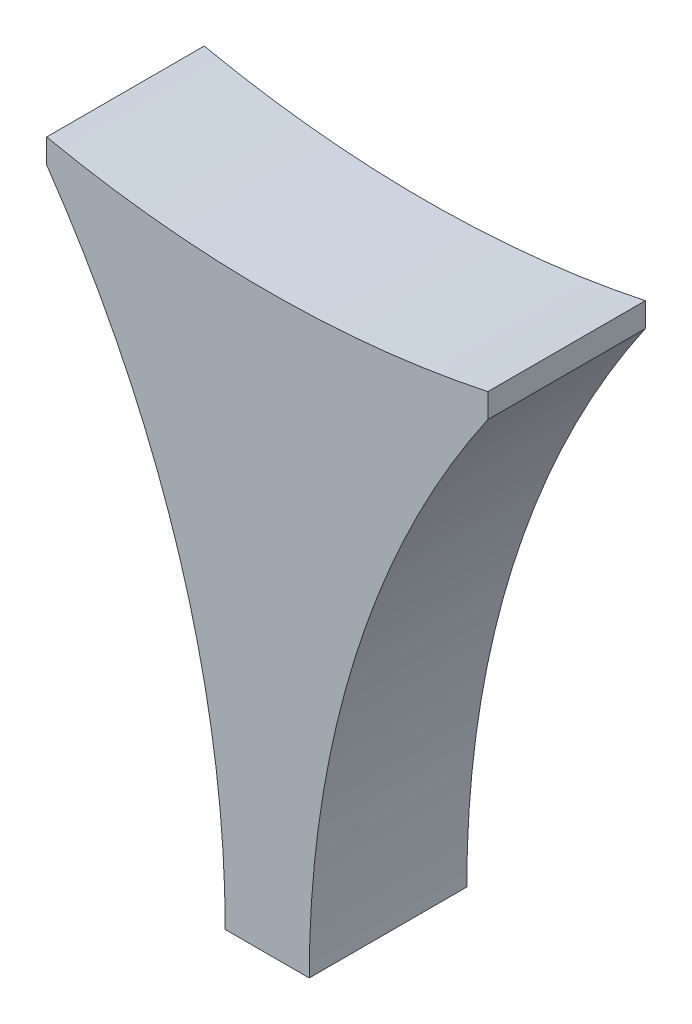
ISO-10303-21;
HEADER;
FILE_DESCRIPTION(('STEP AP214'),'2;1');
FILE_NAME('part.step','',(''),(''),'','','');
FILE_SCHEMA(('AUTOMOTIVE_DESIGN { 1 0 10303 214 1 1 1 1 }'));
ENDSEC;
DATA;
#1=APPLICATION_CONTEXT('core data for automotive mechanical design processes');
#2=APPLICATION_PROTOCOL_DEFINITION('international standard','automotive_design',2000,#1);
#3=PRODUCT_CONTEXT('',#1,'mechanical');
#4=PRODUCT('Part','Part','',(#3));
#5=PRODUCT_RELATED_PRODUCT_CATEGORY('part','',(#4));
#6=PRODUCT_DEFINITION_FORMATION('','',#4);
#7=PRODUCT_DEFINITION_CONTEXT('part definition',#1,'design');
#8=PRODUCT_DEFINITION('design','',#6,#7);
#9=PRODUCT_DEFINITION_SHAPE('','',#8);
#10=(LENGTH_UNIT() NAMED_UNIT(*) SI_UNIT(.MILLI.,.METRE.));
#11=(NAMED_UNIT(*) PLANE_ANGLE_UNIT() SI_UNIT($,.RADIAN.));
#12=(NAMED_UNIT(*) SI_UNIT($,.STERADIAN.) SOLID_ANGLE_UNIT());
#13=UNCERTAINTY_MEASURE_WITH_UNIT(LENGTH_MEASURE(1.E-05),#10,'distance_accuracy_value','');
#14=(GEOMETRIC_REPRESENTATION_CONTEXT(3) GLOBAL_UNCERTAINTY_ASSIGNED_CONTEXT((#13)) GLOBAL_UNIT_ASSIGNED_CONTEXT((#10,
#11,#12)) REPRESENTATION_CONTEXT('',''));
#15=CARTESIAN_POINT('',(0.,0.,0.));
#16=DIRECTION('',(0.,0.,1.));
#17=DIRECTION('',(1.,0.,0.));
#18=AXIS2_PLACEMENT_3D('',#15,#16,#17);
#19=CARTESIAN_POINT('',(-2.10012615450044,429.712168832297,344.000000000001));
#20=DIRECTION('',(-1.,0.,0.));
#21=DIRECTION('',(0.,0.,1.));
#22=AXIS2_PLACEMENT_3D('',#19,#20,#21);
#23=PLANE('',#22);
#24=DIRECTION('',(0.,1.,0.));
#25=VECTOR('',#24,1.);
#26=CARTESIAN_POINT('',(-2.10012615450044,429.712168832297,342.500000000001));
#27=LINE('',#26,#25);
#28=CARTESIAN_POINT('',(-2.10012615450029,430.120755588854,342.500000000001));
#29=VERTEX_POINT('',#28);
#30=CARTESIAN_POINT('',(-2.10012615450062,429.890156342672,342.500000000001));
#31=VERTEX_POINT('',#30);
#32=EDGE_CURVE('E100',#29,#31,#27,.F.);
#33=ORIENTED_EDGE('',*,*,#32,.T.);
#34=DIRECTION('',(0.,0.,-1.));
#35=VECTOR('',#34,1.);
#36=CARTESIAN_POINT('',(-2.1001261545008,429.890156342672,344.000000000001));
#37=LINE('',#36,#35);
#38=CARTESIAN_POINT('',(-2.10012615450062,429.890156342672,344.000000000001));
#39=VERTEX_POINT('',#38);
#40=EDGE_CURVE('E63',#31,#39,#37,.F.);
#41=ORIENTED_EDGE('',*,*,#40,.T.);
#42=DIRECTION('',(0.,1.,0.));
#43=VECTOR('',#42,1.);
#44=CARTESIAN_POINT('',(-2.10012615450044,427.329315402339,344.000000000001));
#45=LINE('',#44,#43);
#46=CARTESIAN_POINT('',(-2.10012615450029,430.120755588854,344.000000000001));
#47=VERTEX_POINT('',#46);
#48=EDGE_CURVE('E84',#39,#47,#45,.T.);
#49=ORIENTED_EDGE('',*,*,#48,.T.);
#50=DIRECTION('',(0.,0.,-1.));
#51=VECTOR('',#50,1.);
#52=CARTESIAN_POINT('',(-2.10012615450014,430.120755588854,344.000000000001));
#53=LINE('',#52,#51);
#54=EDGE_CURVE('E86',#47,#29,#53,.T.);
#55=ORIENTED_EDGE('',*,*,#54,.T.);
#56=EDGE_LOOP('',(#33,#41,#49,#55));
#57=FACE_BOUND('',#56,.T.);
#58=ADVANCED_FACE('F15',(#57),#23,.T.);
#59=CARTESIAN_POINT('',(2.10012615747791,430.223013239108,344.000000000001));
#60=DIRECTION('',(1.,0.,0.));
#61=DIRECTION('',(0.,0.,-1.));
#62=AXIS2_PLACEMENT_3D('',#59,#60,#61);
#63=PLANE('',#62);
#64=DIRECTION('',(0.,1.,0.));
#65=VECTOR('',#64,1.);
#66=CARTESIAN_POINT('',(2.10012615747791,430.223013239108,342.500000000001));
#67=LINE('',#66,#65);
#68=CARTESIAN_POINT('',(2.10012615747792,429.890156343239,342.500000000001));
#69=VERTEX_POINT('',#68);
#70=CARTESIAN_POINT('',(2.10012615747777,430.120755589487,342.500000000001));
#71=VERTEX_POINT('',#70);
#72=EDGE_CURVE('E32',#69,#71,#67,.T.);
#73=ORIENTED_EDGE('',*,*,#72,.T.);
#74=DIRECTION('',(0.,0.,-1.));
#75=VECTOR('',#74,1.);
#76=CARTESIAN_POINT('',(2.10012615747763,430.120755589487,344.000000000001));
#77=LINE('',#76,#75);
#78=CARTESIAN_POINT('',(2.10012615747771,430.120755589487,344.000000000001));
#79=VERTEX_POINT('',#78);
#80=EDGE_CURVE('E94',#71,#79,#77,.F.);
#81=ORIENTED_EDGE('',*,*,#80,.T.);
#82=DIRECTION('',(0.,1.,0.));
#83=VECTOR('',#82,1.);
#84=CARTESIAN_POINT('',(2.10012615747779,427.329315402339,344.000000000001));
#85=LINE('',#84,#83);
#86=CARTESIAN_POINT('',(2.10012615747786,429.890156343239,344.000000000001));
#87=VERTEX_POINT('',#86);
#88=EDGE_CURVE('E79',#79,#87,#85,.F.);
#89=ORIENTED_EDGE('',*,*,#88,.T.);
#90=DIRECTION('',(0.,0.,-1.));
#91=VECTOR('',#90,1.);
#92=CARTESIAN_POINT('',(2.10012615747793,429.890156343239,344.000000000001));
#93=LINE('',#92,#91);
#94=EDGE_CURVE('E107',#87,#69,#93,.T.);
#95=ORIENTED_EDGE('',*,*,#94,.T.);
#96=EDGE_LOOP('',(#73,#81,#89,#95));
#97=FACE_BOUND('',#96,.T.);
#98=ADVANCED_FACE('F126',(#97),#63,.T.);
#99=CARTESIAN_POINT('',(1.48873746663725E-09,427.329315402339,344.000000000001));
#100=DIRECTION('',(0.,0.,-1.));
#101=DIRECTION('',(-1.,0.,0.));
#102=AXIS2_PLACEMENT_3D('',#99,#100,#101);
#103=PLANE('',#102);
#104=CARTESIAN_POINT('',(9.99999999999459,424.435617566144,344.000000000001));
#105=DIRECTION('',(0.,0.,-1.));
#106=DIRECTION('',(-1.,0.,0.));
#107=AXIS2_PLACEMENT_3D('',#104,#105,#106);
#108=CIRCLE('',#107,9.5999999999225);
#109=CARTESIAN_POINT('',(0.400000000072089,424.435617565888,344.000000000001));
#110=VERTEX_POINT('',#109);
#111=EDGE_CURVE('E105',#110,#87,#108,.T.);
#112=ORIENTED_EDGE('',*,*,#111,.T.);
#113=ORIENTED_EDGE('',*,*,#88,.F.);
#114=CARTESIAN_POINT('',(-2.85327317332453E-13,440.000000000001,344.000000000001));
#115=DIRECTION('',(0.,0.,-1.));
#116=DIRECTION('',(-1.,0.,0.));
#117=AXIS2_PLACEMENT_3D('',#114,#115,#116);
#118=CIRCLE('',#117,10.1);
#119=EDGE_CURVE('E106',#79,#47,#118,.T.);
#120=ORIENTED_EDGE('',*,*,#119,.T.);
#121=ORIENTED_EDGE('',*,*,#48,.F.);
#122=CARTESIAN_POINT('',(-10.0000000000003,424.435617565712,344.000000000001));
#123=DIRECTION('',(0.,0.,-1.));
#124=DIRECTION('',(-1.,0.,0.));
#125=AXIS2_PLACEMENT_3D('',#122,#123,#124);
#126=CIRCLE('',#125,9.60000000230026);
#127=CARTESIAN_POINT('',(-0.39999999770004,424.435617565637,344.000000000001));
#128=VERTEX_POINT('',#127);
#129=EDGE_CURVE('E18',#39,#128,#126,.T.);
#130=ORIENTED_EDGE('',*,*,#129,.T.);
#131=DIRECTION('',(1.,-6.37458340081918E-12,0.));
#132=VECTOR('',#131,1.);
#133=CARTESIAN_POINT('',(0.500000000072083,424.435617565631,344.000000000001));
#134=LINE('',#133,#132);
#135=EDGE_CURVE('E68',#110,#128,#134,.F.);
#136=ORIENTED_EDGE('',*,*,#135,.F.);
#137=EDGE_LOOP('',(#112,#113,#120,#121,#130,#136));
#138=FACE_BOUND('',#137,.T.);
#139=ADVANCED_FACE('F82',(#138),#103,.F.);
#140=CARTESIAN_POINT('',(0.500000000072083,424.435617565631,344.000000000001));
#141=DIRECTION('',(-6.37458340081918E-12,-1.,0.));
#142=DIRECTION('',(1.,-6.37458340081918E-12,0.));
#143=AXIS2_PLACEMENT_3D('',#140,#141,#142);
#144=PLANE('',#143);
#145=DIRECTION('',(-1.,0.,0.));
#146=VECTOR('',#145,1.);
#147=CARTESIAN_POINT('',(1.48873746663725E-09,424.435617565632,342.500000000001));
#148=LINE('',#147,#146);
#149=CARTESIAN_POINT('',(0.400000000072089,424.435617565888,342.500000000001));
#150=VERTEX_POINT('',#149);
#151=CARTESIAN_POINT('',(-0.39999999770004,424.435617565635,342.500000000001));
#152=VERTEX_POINT('',#151);
#153=EDGE_CURVE('E104',#150,#152,#148,.T.);
#154=ORIENTED_EDGE('',*,*,#153,.F.);
#155=DIRECTION('',(0.,0.,-1.));
#156=VECTOR('',#155,1.);
#157=CARTESIAN_POINT('',(0.400000000072089,424.435617566144,344.000000000001));
#158=LINE('',#157,#156);
#159=EDGE_CURVE('E75',#150,#110,#158,.F.);
#160=ORIENTED_EDGE('',*,*,#159,.T.);
#161=ORIENTED_EDGE('',*,*,#135,.T.);
#162=DIRECTION('',(0.,0.,-1.));
#163=VECTOR('',#162,1.);
#164=CARTESIAN_POINT('',(-0.39999999770004,424.435617565637,344.000000000001));
#165=LINE('',#164,#163);
#166=EDGE_CURVE('E72',#128,#152,#165,.T.);
#167=ORIENTED_EDGE('',*,*,#166,.T.);
#168=EDGE_LOOP('',(#154,#160,#161,#167));
#169=FACE_BOUND('',#168,.T.);
#170=ADVANCED_FACE('F70',(#169),#144,.T.);
#171=CARTESIAN_POINT('',(-10.0000000000003,424.435617565712,344.000000000001));
#172=DIRECTION('',(0.,0.,-1.));
#173=DIRECTION('',(-1.,0.,0.));
#174=AXIS2_PLACEMENT_3D('',#171,#172,#173);
#175=CYLINDRICAL_SURFACE('',#174,9.60000000230026);
#176=ORIENTED_EDGE('',*,*,#40,.F.);
#177=CARTESIAN_POINT('',(-10.0000000000003,424.435617565712,342.500000000001));
#178=DIRECTION('',(0.,0.,-1.));
#179=DIRECTION('',(-1.,0.,0.));
#180=AXIS2_PLACEMENT_3D('',#177,#178,#179);
#181=CIRCLE('',#180,9.60000000230026);
#182=EDGE_CURVE('E89',#152,#31,#181,.F.);
#183=ORIENTED_EDGE('',*,*,#182,.F.);
#184=ORIENTED_EDGE('',*,*,#166,.F.);
#185=ORIENTED_EDGE('',*,*,#129,.F.);
#186=EDGE_LOOP('',(#176,#183,#184,#185));
#187=FACE_BOUND('',#186,.T.);
#188=ADVANCED_FACE('F87',(#187),#175,.F.);
#189=CARTESIAN_POINT('',(-2.85327317332453E-13,440.000000000001,344.000000000001));
#190=DIRECTION('',(0.,0.,-1.));
#191=DIRECTION('',(-1.,0.,0.));
#192=AXIS2_PLACEMENT_3D('',#189,#190,#191);
#193=CYLINDRICAL_SURFACE('',#192,10.1);
#194=ORIENTED_EDGE('',*,*,#80,.F.);
#195=CARTESIAN_POINT('',(-2.85327317332453E-13,440.000000000001,342.500000000001));
#196=DIRECTION('',(0.,0.,-1.));
#197=DIRECTION('',(-1.,0.,0.));
#198=AXIS2_PLACEMENT_3D('',#195,#196,#197);
#199=CIRCLE('',#198,10.1);
#200=EDGE_CURVE('E24',#29,#71,#199,.F.);
#201=ORIENTED_EDGE('',*,*,#200,.F.);
#202=ORIENTED_EDGE('',*,*,#54,.F.);
#203=ORIENTED_EDGE('',*,*,#119,.F.);
#204=EDGE_LOOP('',(#194,#201,#202,#203));
#205=FACE_BOUND('',#204,.T.);
#206=ADVANCED_FACE('F124',(#205),#193,.F.);
#207=CARTESIAN_POINT('',(9.99999999999459,424.435617566144,344.000000000001));
#208=DIRECTION('',(0.,0.,-1.));
#209=DIRECTION('',(-1.,0.,0.));
#210=AXIS2_PLACEMENT_3D('',#207,#208,#209);
#211=CYLINDRICAL_SURFACE('',#210,9.5999999999225);
#212=ORIENTED_EDGE('',*,*,#159,.F.);
#213=CARTESIAN_POINT('',(9.99999999999459,424.435617566144,342.500000000001));
#214=DIRECTION('',(0.,0.,-1.));
#215=DIRECTION('',(-1.,0.,0.));
#216=AXIS2_PLACEMENT_3D('',#213,#214,#215);
#217=CIRCLE('',#216,9.5999999999225);
#218=EDGE_CURVE('E9',#69,#150,#217,.F.);
#219=ORIENTED_EDGE('',*,*,#218,.F.);
#220=ORIENTED_EDGE('',*,*,#94,.F.);
#221=ORIENTED_EDGE('',*,*,#111,.F.);
#222=EDGE_LOOP('',(#212,#219,#220,#221));
#223=FACE_BOUND('',#222,.T.);
#224=ADVANCED_FACE('F121',(#223),#211,.F.);
#225=CARTESIAN_POINT('',(1.48873746663725E-09,427.329315402339,342.500000000001));
#226=DIRECTION('',(0.,0.,-1.));
#227=DIRECTION('',(-1.,0.,0.));
#228=AXIS2_PLACEMENT_3D('',#225,#226,#227);
#229=PLANE('',#228);
#230=ORIENTED_EDGE('',*,*,#72,.F.);
#231=ORIENTED_EDGE('',*,*,#218,.T.);
#232=ORIENTED_EDGE('',*,*,#153,.T.);
#233=ORIENTED_EDGE('',*,*,#182,.T.);
#234=ORIENTED_EDGE('',*,*,#32,.F.);
#235=ORIENTED_EDGE('',*,*,#200,.T.);
#236=EDGE_LOOP('',(#230,#231,#232,#233,#234,#235));
#237=FACE_BOUND('',#236,.T.);
#238=ADVANCED_FACE('F118',(#237),#229,.T.);
#239=CLOSED_SHELL('',(#58,#98,#139,#170,#188,#206,#224,#238));
#240=MANIFOLD_SOLID_BREP('B1',#239);
#241=ADVANCED_BREP_SHAPE_REPRESENTATION('',(#18,#240),#14);
#242=SHAPE_DEFINITION_REPRESENTATION(#9,#241);
ENDSEC;
END-ISO-10303-21;
